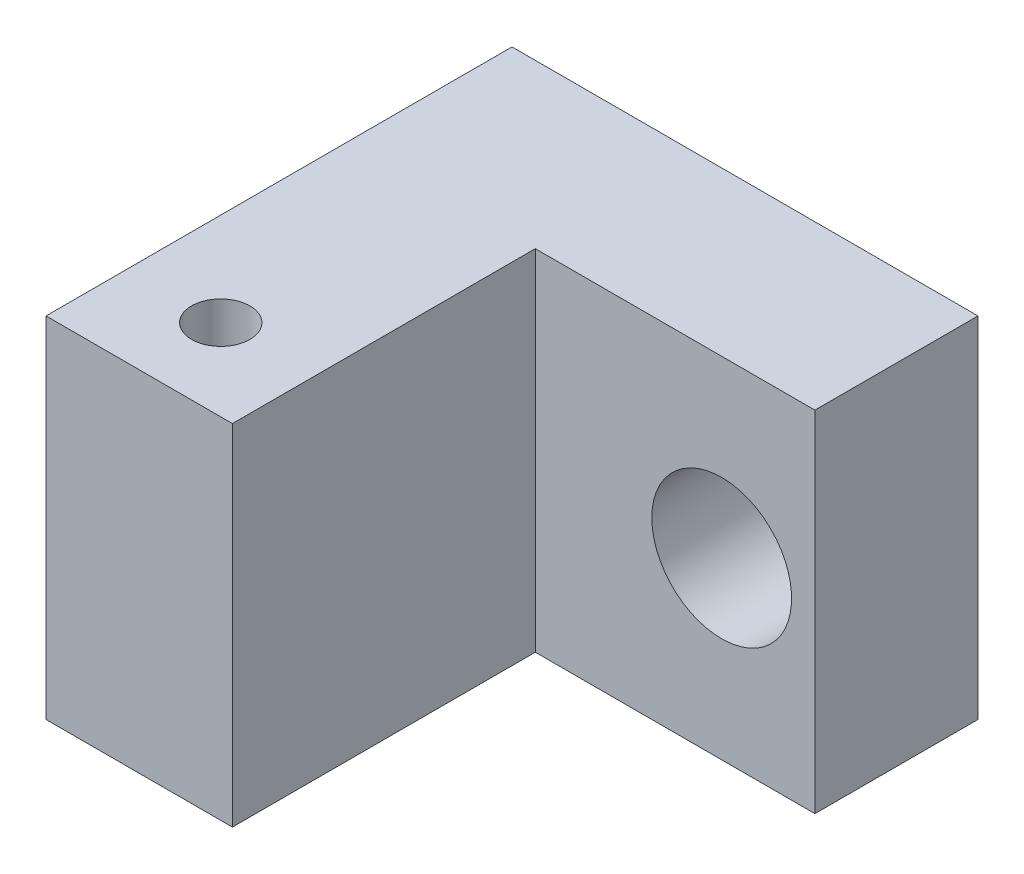
ISO-10303-21;
HEADER;
FILE_DESCRIPTION(('STEP AP214'),'2;1');
FILE_NAME('part.step','',(''),(''),'','','');
FILE_SCHEMA(('AUTOMOTIVE_DESIGN { 1 0 10303 214 1 1 1 1 }'));
ENDSEC;
DATA;
#1=APPLICATION_CONTEXT('core data for automotive mechanical design processes');
#2=APPLICATION_PROTOCOL_DEFINITION('international standard','automotive_design',2000,#1);
#3=PRODUCT_CONTEXT('',#1,'mechanical');
#4=PRODUCT('Part','Part','',(#3));
#5=PRODUCT_RELATED_PRODUCT_CATEGORY('part','',(#4));
#6=PRODUCT_DEFINITION_FORMATION('','',#4);
#7=PRODUCT_DEFINITION_CONTEXT('part definition',#1,'design');
#8=PRODUCT_DEFINITION('design','',#6,#7);
#9=PRODUCT_DEFINITION_SHAPE('','',#8);
#10=(LENGTH_UNIT() NAMED_UNIT(*) SI_UNIT(.MILLI.,.METRE.));
#11=(NAMED_UNIT(*) PLANE_ANGLE_UNIT() SI_UNIT($,.RADIAN.));
#12=(NAMED_UNIT(*) SI_UNIT($,.STERADIAN.) SOLID_ANGLE_UNIT());
#13=UNCERTAINTY_MEASURE_WITH_UNIT(LENGTH_MEASURE(1.E-05),#10,'distance_accuracy_value','');
#14=(GEOMETRIC_REPRESENTATION_CONTEXT(3) GLOBAL_UNCERTAINTY_ASSIGNED_CONTEXT((#13)) GLOBAL_UNIT_ASSIGNED_CONTEXT((#10,
#11,#12)) REPRESENTATION_CONTEXT('',''));
#15=CARTESIAN_POINT('',(0.,0.,0.));
#16=DIRECTION('',(0.,0.,1.));
#17=DIRECTION('',(1.,0.,0.));
#18=AXIS2_PLACEMENT_3D('',#15,#16,#17);
#19=CARTESIAN_POINT('',(20.,15.,7.));
#20=DIRECTION('',(-1.,0.,0.));
#21=DIRECTION('',(0.,0.,1.));
#22=AXIS2_PLACEMENT_3D('',#19,#20,#21);
#23=PLANE('',#22);
#24=DIRECTION('',(0.,0.,-1.));
#25=VECTOR('',#24,1.);
#26=CARTESIAN_POINT('',(20.,0.,7.));
#27=LINE('',#26,#25);
#28=CARTESIAN_POINT('',(20.,0.,7.));
#29=VERTEX_POINT('',#28);
#30=CARTESIAN_POINT('',(20.,0.,0.));
#31=VERTEX_POINT('',#30);
#32=EDGE_CURVE('E151',#29,#31,#27,.T.);
#33=ORIENTED_EDGE('',*,*,#32,.T.);
#34=DIRECTION('',(0.,-1.,0.));
#35=VECTOR('',#34,1.);
#36=CARTESIAN_POINT('',(20.,15.,0.));
#37=LINE('',#36,#35);
#38=CARTESIAN_POINT('',(20.,15.,0.));
#39=VERTEX_POINT('',#38);
#40=EDGE_CURVE('E12',#39,#31,#37,.T.);
#41=ORIENTED_EDGE('',*,*,#40,.F.);
#42=DIRECTION('',(0.,0.,-1.));
#43=VECTOR('',#42,1.);
#44=CARTESIAN_POINT('',(20.,15.,7.));
#45=LINE('',#44,#43);
#46=CARTESIAN_POINT('',(20.,15.,7.));
#47=VERTEX_POINT('',#46);
#48=EDGE_CURVE('E134',#47,#39,#45,.T.);
#49=ORIENTED_EDGE('',*,*,#48,.F.);
#50=DIRECTION('',(0.,-1.,0.));
#51=VECTOR('',#50,1.);
#52=CARTESIAN_POINT('',(20.,15.,7.));
#53=LINE('',#52,#51);
#54=EDGE_CURVE('E117',#47,#29,#53,.T.);
#55=ORIENTED_EDGE('',*,*,#54,.T.);
#56=EDGE_LOOP('',(#33,#41,#49,#55));
#57=FACE_BOUND('',#56,.T.);
#58=ADVANCED_FACE('F37',(#57),#23,.F.);
#59=CARTESIAN_POINT('',(0.,15.,0.));
#60=DIRECTION('',(0.,0.,1.));
#61=DIRECTION('',(1.,0.,0.));
#62=AXIS2_PLACEMENT_3D('',#59,#60,#61);
#63=PLANE('',#62);
#64=CARTESIAN_POINT('',(16.,7.5,0.));
#65=DIRECTION('',(0.,0.,-1.));
#66=DIRECTION('',(-1.,0.,0.));
#67=AXIS2_PLACEMENT_3D('',#64,#65,#66);
#68=CIRCLE('',#67,3.);
#69=CARTESIAN_POINT('',(13.,7.5,0.));
#70=VERTEX_POINT('',#69);
#71=EDGE_CURVE('E157',#70,#70,#68,.T.);
#72=ORIENTED_EDGE('',*,*,#71,.F.);
#73=EDGE_LOOP('',(#72));
#74=FACE_BOUND('',#73,.T.);
#75=DIRECTION('',(-1.,0.,0.));
#76=VECTOR('',#75,1.);
#77=CARTESIAN_POINT('',(0.,0.,0.));
#78=LINE('',#77,#76);
#79=CARTESIAN_POINT('',(0.,0.,0.));
#80=VERTEX_POINT('',#79);
#81=EDGE_CURVE('E150',#31,#80,#78,.T.);
#82=ORIENTED_EDGE('',*,*,#81,.T.);
#83=DIRECTION('',(0.,-1.,0.));
#84=VECTOR('',#83,1.);
#85=CARTESIAN_POINT('',(0.,15.,0.));
#86=LINE('',#85,#84);
#87=CARTESIAN_POINT('',(0.,15.,0.));
#88=VERTEX_POINT('',#87);
#89=EDGE_CURVE('E46',#88,#80,#86,.T.);
#90=ORIENTED_EDGE('',*,*,#89,.F.);
#91=DIRECTION('',(-1.,0.,0.));
#92=VECTOR('',#91,1.);
#93=CARTESIAN_POINT('',(0.,15.,0.));
#94=LINE('',#93,#92);
#95=EDGE_CURVE('E91',#39,#88,#94,.T.);
#96=ORIENTED_EDGE('',*,*,#95,.F.);
#97=ORIENTED_EDGE('',*,*,#40,.T.);
#98=EDGE_LOOP('',(#82,#90,#96,#97));
#99=FACE_BOUND('',#98,.T.);
#100=ADVANCED_FACE('F172',(#74,#99),#63,.F.);
#101=CARTESIAN_POINT('',(0.,15.,0.));
#102=DIRECTION('',(1.,0.,0.));
#103=DIRECTION('',(0.,0.,-1.));
#104=AXIS2_PLACEMENT_3D('',#101,#102,#103);
#105=PLANE('',#104);
#106=DIRECTION('',(0.,0.,1.));
#107=VECTOR('',#106,1.);
#108=CARTESIAN_POINT('',(0.,0.,0.));
#109=LINE('',#108,#107);
#110=CARTESIAN_POINT('',(0.,0.,20.));
#111=VERTEX_POINT('',#110);
#112=EDGE_CURVE('E146',#80,#111,#109,.T.);
#113=ORIENTED_EDGE('',*,*,#112,.T.);
#114=DIRECTION('',(0.,-1.,0.));
#115=VECTOR('',#114,1.);
#116=CARTESIAN_POINT('',(0.,15.,20.));
#117=LINE('',#116,#115);
#118=CARTESIAN_POINT('',(0.,15.,20.));
#119=VERTEX_POINT('',#118);
#120=EDGE_CURVE('E113',#119,#111,#117,.T.);
#121=ORIENTED_EDGE('',*,*,#120,.F.);
#122=DIRECTION('',(0.,0.,1.));
#123=VECTOR('',#122,1.);
#124=CARTESIAN_POINT('',(0.,15.,0.));
#125=LINE('',#124,#123);
#126=EDGE_CURVE('E104',#88,#119,#125,.T.);
#127=ORIENTED_EDGE('',*,*,#126,.F.);
#128=ORIENTED_EDGE('',*,*,#89,.T.);
#129=EDGE_LOOP('',(#113,#121,#127,#128));
#130=FACE_BOUND('',#129,.T.);
#131=ADVANCED_FACE('F145',(#130),#105,.F.);
#132=CARTESIAN_POINT('',(0.,15.,20.));
#133=DIRECTION('',(0.,0.,-1.));
#134=DIRECTION('',(-1.,0.,0.));
#135=AXIS2_PLACEMENT_3D('',#132,#133,#134);
#136=PLANE('',#135);
#137=DIRECTION('',(1.,0.,0.));
#138=VECTOR('',#137,1.);
#139=CARTESIAN_POINT('',(0.,0.,20.));
#140=LINE('',#139,#138);
#141=CARTESIAN_POINT('',(8.,0.,20.));
#142=VERTEX_POINT('',#141);
#143=EDGE_CURVE('E112',#111,#142,#140,.T.);
#144=ORIENTED_EDGE('',*,*,#143,.T.);
#145=DIRECTION('',(0.,-1.,0.));
#146=VECTOR('',#145,1.);
#147=CARTESIAN_POINT('',(8.,15.,20.));
#148=LINE('',#147,#146);
#149=CARTESIAN_POINT('',(8.,15.,20.));
#150=VERTEX_POINT('',#149);
#151=EDGE_CURVE('E109',#150,#142,#148,.T.);
#152=ORIENTED_EDGE('',*,*,#151,.F.);
#153=DIRECTION('',(1.,0.,0.));
#154=VECTOR('',#153,1.);
#155=CARTESIAN_POINT('',(0.,15.,20.));
#156=LINE('',#155,#154);
#157=EDGE_CURVE('E98',#119,#150,#156,.T.);
#158=ORIENTED_EDGE('',*,*,#157,.F.);
#159=ORIENTED_EDGE('',*,*,#120,.T.);
#160=EDGE_LOOP('',(#144,#152,#158,#159));
#161=FACE_BOUND('',#160,.T.);
#162=ADVANCED_FACE('F110',(#161),#136,.F.);
#163=CARTESIAN_POINT('',(8.,15.,20.));
#164=DIRECTION('',(-1.,0.,0.));
#165=DIRECTION('',(0.,0.,1.));
#166=AXIS2_PLACEMENT_3D('',#163,#164,#165);
#167=PLANE('',#166);
#168=DIRECTION('',(0.,0.,-1.));
#169=VECTOR('',#168,1.);
#170=CARTESIAN_POINT('',(8.,0.,20.));
#171=LINE('',#170,#169);
#172=CARTESIAN_POINT('',(8.,0.,7.));
#173=VERTEX_POINT('',#172);
#174=EDGE_CURVE('E77',#142,#173,#171,.T.);
#175=ORIENTED_EDGE('',*,*,#174,.T.);
#176=DIRECTION('',(0.,-1.,0.));
#177=VECTOR('',#176,1.);
#178=CARTESIAN_POINT('',(8.,15.,7.));
#179=LINE('',#178,#177);
#180=CARTESIAN_POINT('',(8.,15.,7.));
#181=VERTEX_POINT('',#180);
#182=EDGE_CURVE('E114',#181,#173,#179,.T.);
#183=ORIENTED_EDGE('',*,*,#182,.F.);
#184=DIRECTION('',(0.,0.,-1.));
#185=VECTOR('',#184,1.);
#186=CARTESIAN_POINT('',(8.,15.,20.));
#187=LINE('',#186,#185);
#188=EDGE_CURVE('E102',#150,#181,#187,.T.);
#189=ORIENTED_EDGE('',*,*,#188,.F.);
#190=ORIENTED_EDGE('',*,*,#151,.T.);
#191=EDGE_LOOP('',(#175,#183,#189,#190));
#192=FACE_BOUND('',#191,.T.);
#193=ADVANCED_FACE('F115',(#192),#167,.F.);
#194=CARTESIAN_POINT('',(8.,15.,7.));
#195=DIRECTION('',(0.,0.,-1.));
#196=DIRECTION('',(-1.,0.,0.));
#197=AXIS2_PLACEMENT_3D('',#194,#195,#196);
#198=PLANE('',#197);
#199=CARTESIAN_POINT('',(16.,7.5,7.));
#200=DIRECTION('',(0.,0.,-1.));
#201=DIRECTION('',(-1.,0.,0.));
#202=AXIS2_PLACEMENT_3D('',#199,#200,#201);
#203=CIRCLE('',#202,3.);
#204=CARTESIAN_POINT('',(13.,7.5,7.));
#205=VERTEX_POINT('',#204);
#206=EDGE_CURVE('E40',#205,#205,#203,.T.);
#207=ORIENTED_EDGE('',*,*,#206,.T.);
#208=EDGE_LOOP('',(#207));
#209=FACE_BOUND('',#208,.T.);
#210=DIRECTION('',(1.,0.,0.));
#211=VECTOR('',#210,1.);
#212=CARTESIAN_POINT('',(8.,0.,7.));
#213=LINE('',#212,#211);
#214=EDGE_CURVE('E83',#173,#29,#213,.T.);
#215=ORIENTED_EDGE('',*,*,#214,.T.);
#216=ORIENTED_EDGE('',*,*,#54,.F.);
#217=DIRECTION('',(1.,0.,0.));
#218=VECTOR('',#217,1.);
#219=CARTESIAN_POINT('',(8.,15.,7.));
#220=LINE('',#219,#218);
#221=EDGE_CURVE('E54',#181,#47,#220,.T.);
#222=ORIENTED_EDGE('',*,*,#221,.F.);
#223=ORIENTED_EDGE('',*,*,#182,.T.);
#224=EDGE_LOOP('',(#215,#216,#222,#223));
#225=FACE_BOUND('',#224,.T.);
#226=ADVANCED_FACE('F185',(#209,#225),#198,.F.);
#227=CARTESIAN_POINT('',(0.,15.,0.));
#228=DIRECTION('',(0.,-1.,0.));
#229=DIRECTION('',(0.,0.,-1.));
#230=AXIS2_PLACEMENT_3D('',#227,#228,#229);
#231=PLANE('',#230);
#232=CARTESIAN_POINT('',(4.,15.,16.5));
#233=DIRECTION('',(0.,1.,0.));
#234=DIRECTION('',(0.,0.,1.));
#235=AXIS2_PLACEMENT_3D('',#232,#233,#234);
#236=CIRCLE('',#235,1.24999999999999);
#237=CARTESIAN_POINT('',(4.,15.,17.75));
#238=VERTEX_POINT('',#237);
#239=EDGE_CURVE('E166',#238,#238,#236,.T.);
#240=ORIENTED_EDGE('',*,*,#239,.F.);
#241=EDGE_LOOP('',(#240));
#242=FACE_BOUND('',#241,.T.);
#243=ORIENTED_EDGE('',*,*,#48,.T.);
#244=ORIENTED_EDGE('',*,*,#95,.T.);
#245=ORIENTED_EDGE('',*,*,#126,.T.);
#246=ORIENTED_EDGE('',*,*,#157,.T.);
#247=ORIENTED_EDGE('',*,*,#188,.T.);
#248=ORIENTED_EDGE('',*,*,#221,.T.);
#249=EDGE_LOOP('',(#243,#244,#245,#246,#247,#248));
#250=FACE_BOUND('',#249,.T.);
#251=ADVANCED_FACE('F100',(#242,#250),#231,.F.);
#252=CARTESIAN_POINT('',(0.,0.,0.));
#253=DIRECTION('',(0.,-1.,0.));
#254=DIRECTION('',(0.,0.,-1.));
#255=AXIS2_PLACEMENT_3D('',#252,#253,#254);
#256=PLANE('',#255);
#257=CARTESIAN_POINT('',(4.,0.,16.5));
#258=DIRECTION('',(0.,1.,0.));
#259=DIRECTION('',(0.,0.,1.));
#260=AXIS2_PLACEMENT_3D('',#257,#258,#259);
#261=CIRCLE('',#260,1.25);
#262=CARTESIAN_POINT('',(4.,0.,17.75));
#263=VERTEX_POINT('',#262);
#264=EDGE_CURVE('E161',#263,#263,#261,.T.);
#265=ORIENTED_EDGE('',*,*,#264,.T.);
#266=EDGE_LOOP('',(#265));
#267=FACE_BOUND('',#266,.T.);
#268=ORIENTED_EDGE('',*,*,#32,.F.);
#269=ORIENTED_EDGE('',*,*,#214,.F.);
#270=ORIENTED_EDGE('',*,*,#174,.F.);
#271=ORIENTED_EDGE('',*,*,#143,.F.);
#272=ORIENTED_EDGE('',*,*,#112,.F.);
#273=ORIENTED_EDGE('',*,*,#81,.F.);
#274=EDGE_LOOP('',(#268,#269,#270,#271,#272,#273));
#275=FACE_BOUND('',#274,.T.);
#276=ADVANCED_FACE('F149',(#267,#275),#256,.T.);
#277=CARTESIAN_POINT('',(16.,7.5,10.));
#278=DIRECTION('',(0.,0.,-1.));
#279=DIRECTION('',(-1.,0.,0.));
#280=AXIS2_PLACEMENT_3D('',#277,#278,#279);
#281=CYLINDRICAL_SURFACE('',#280,3.);
#282=ORIENTED_EDGE('',*,*,#71,.T.);
#283=EDGE_LOOP('',(#282));
#284=FACE_BOUND('',#283,.T.);
#285=ORIENTED_EDGE('',*,*,#206,.F.);
#286=EDGE_LOOP('',(#285));
#287=FACE_BOUND('',#286,.T.);
#288=ADVANCED_FACE('F190',(#284,#287),#281,.F.);
#289=CARTESIAN_POINT('',(4.,15.,16.5));
#290=DIRECTION('',(0.,1.,0.));
#291=DIRECTION('',(0.,0.,1.));
#292=AXIS2_PLACEMENT_3D('',#289,#290,#291);
#293=CYLINDRICAL_SURFACE('',#292,1.24999999999999);
#294=ORIENTED_EDGE('',*,*,#264,.F.);
#295=EDGE_LOOP('',(#294));
#296=FACE_BOUND('',#295,.T.);
#297=ORIENTED_EDGE('',*,*,#239,.T.);
#298=EDGE_LOOP('',(#297));
#299=FACE_BOUND('',#298,.T.);
#300=ADVANCED_FACE('F197',(#296,#299),#293,.F.);
#301=CLOSED_SHELL('',(#58,#100,#131,#162,#193,#226,#251,#276,#288,#300));
#302=MANIFOLD_SOLID_BREP('B2',#301);
#303=ADVANCED_BREP_SHAPE_REPRESENTATION('',(#18,#302),#14);
#304=SHAPE_DEFINITION_REPRESENTATION(#9,#303);
ENDSEC;
END-ISO-10303-21;
